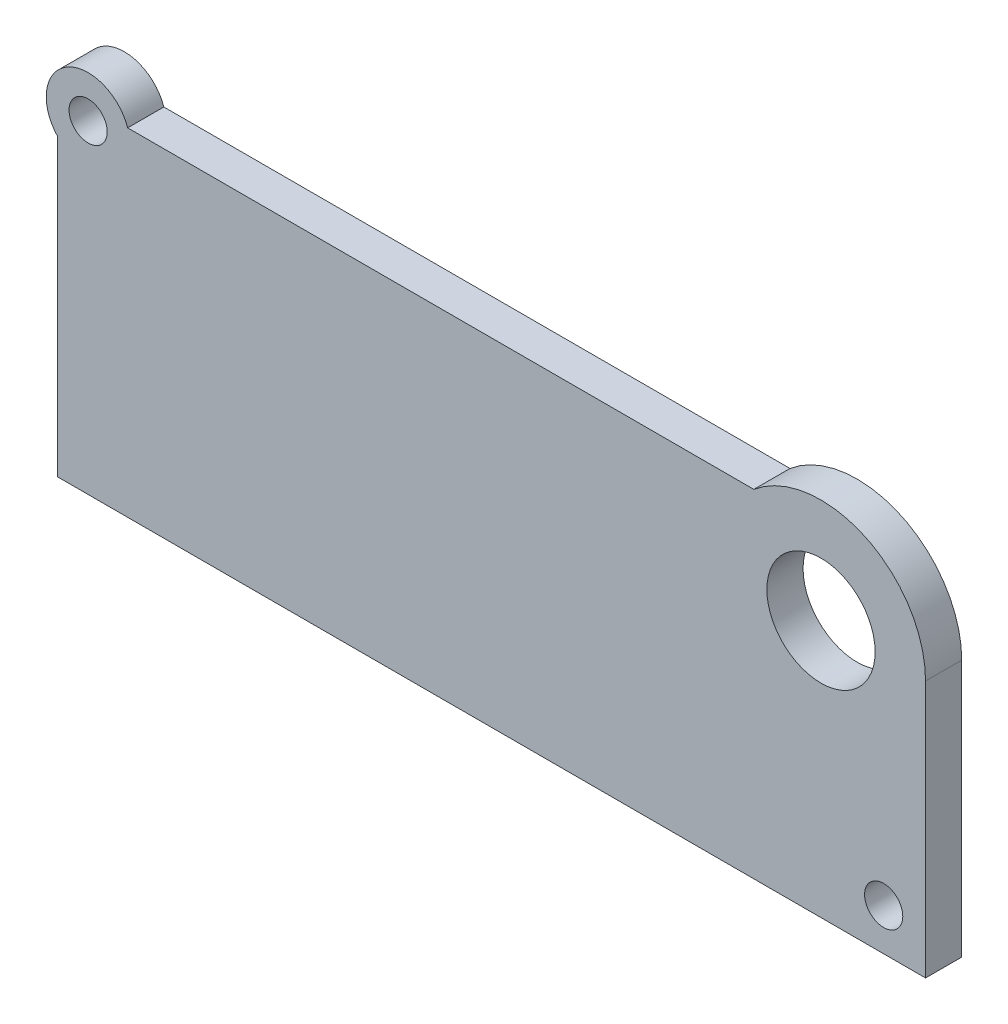
ISO-10303-21;
HEADER;
FILE_DESCRIPTION(('STEP AP214'),'2;1');
FILE_NAME('part.step','',(''),(''),'','','');
FILE_SCHEMA(('AUTOMOTIVE_DESIGN { 1 0 10303 214 1 1 1 1 }'));
ENDSEC;
DATA;
#1=APPLICATION_CONTEXT('core data for automotive mechanical design processes');
#2=APPLICATION_PROTOCOL_DEFINITION('international standard','automotive_design',2000,#1);
#3=PRODUCT_CONTEXT('',#1,'mechanical');
#4=PRODUCT('Part','Part','',(#3));
#5=PRODUCT_RELATED_PRODUCT_CATEGORY('part','',(#4));
#6=PRODUCT_DEFINITION_FORMATION('','',#4);
#7=PRODUCT_DEFINITION_CONTEXT('part definition',#1,'design');
#8=PRODUCT_DEFINITION('design','',#6,#7);
#9=PRODUCT_DEFINITION_SHAPE('','',#8);
#10=(LENGTH_UNIT() NAMED_UNIT(*) SI_UNIT(.MILLI.,.METRE.));
#11=(NAMED_UNIT(*) PLANE_ANGLE_UNIT() SI_UNIT($,.RADIAN.));
#12=(NAMED_UNIT(*) SI_UNIT($,.STERADIAN.) SOLID_ANGLE_UNIT());
#13=UNCERTAINTY_MEASURE_WITH_UNIT(LENGTH_MEASURE(1.E-05),#10,'distance_accuracy_value','');
#14=(GEOMETRIC_REPRESENTATION_CONTEXT(3) GLOBAL_UNCERTAINTY_ASSIGNED_CONTEXT((#13)) GLOBAL_UNIT_ASSIGNED_CONTEXT((#10,
#11,#12)) REPRESENTATION_CONTEXT('',''));
#15=CARTESIAN_POINT('',(0.,0.,0.));
#16=DIRECTION('',(0.,0.,1.));
#17=DIRECTION('',(1.,0.,0.));
#18=AXIS2_PLACEMENT_3D('',#15,#16,#17);
#19=CARTESIAN_POINT('',(0.,14.8,3.175));
#20=DIRECTION('',(0.,1.,0.));
#21=DIRECTION('',(0.,0.,1.));
#22=AXIS2_PLACEMENT_3D('',#19,#20,#21);
#23=PLANE('',#22);
#24=DIRECTION('',(0.,0.,-1.));
#25=VECTOR('',#24,1.);
#26=CARTESIAN_POINT('',(-20.2659099435317,14.8,13.5694696834423));
#27=LINE('',#26,#25);
#28=CARTESIAN_POINT('',(-20.2659099435317,14.8,3.175));
#29=VERTEX_POINT('',#28);
#30=CARTESIAN_POINT('',(-20.2659099435317,14.8,0.));
#31=VERTEX_POINT('',#30);
#32=EDGE_CURVE('E134',#29,#31,#27,.T.);
#33=ORIENTED_EDGE('',*,*,#32,.F.);
#34=DIRECTION('',(1.,0.,0.));
#35=VECTOR('',#34,1.);
#36=CARTESIAN_POINT('',(0.,14.8,3.175));
#37=LINE('',#36,#35);
#38=CARTESIAN_POINT('',(34.6802621326928,14.8,3.175));
#39=VERTEX_POINT('',#38);
#40=EDGE_CURVE('E123',#29,#39,#37,.T.);
#41=ORIENTED_EDGE('',*,*,#40,.T.);
#42=DIRECTION('',(0.,0.,-1.));
#43=VECTOR('',#42,1.);
#44=CARTESIAN_POINT('',(34.6802621326928,14.8,15.1599874843489));
#45=LINE('',#44,#43);
#46=CARTESIAN_POINT('',(34.6802621326928,14.8,0.));
#47=VERTEX_POINT('',#46);
#48=EDGE_CURVE('E168',#39,#47,#45,.T.);
#49=ORIENTED_EDGE('',*,*,#48,.T.);
#50=DIRECTION('',(1.,0.,0.));
#51=VECTOR('',#50,1.);
#52=CARTESIAN_POINT('',(0.,14.8,0.));
#53=LINE('',#52,#51);
#54=EDGE_CURVE('E83',#31,#47,#53,.T.);
#55=ORIENTED_EDGE('',*,*,#54,.F.);
#56=EDGE_LOOP('',(#33,#41,#49,#55));
#57=FACE_BOUND('',#56,.T.);
#58=ADVANCED_FACE('F67',(#57),#23,.T.);
#59=CARTESIAN_POINT('',(0.,0.,0.));
#60=DIRECTION('',(0.,0.,1.));
#61=DIRECTION('',(1.,0.,0.));
#62=AXIS2_PLACEMENT_3D('',#59,#60,#61);
#63=PLANE('',#62);
#64=CARTESIAN_POINT('',(46.076,-11.125,0.));
#65=DIRECTION('',(0.,0.,-1.));
#66=DIRECTION('',(-1.,0.,0.));
#67=AXIS2_PLACEMENT_3D('',#64,#65,#66);
#68=CIRCLE('',#67,1.675);
#69=CARTESIAN_POINT('',(44.401,-11.125,0.));
#70=VERTEX_POINT('',#69);
#71=EDGE_CURVE('E232',#70,#70,#68,.T.);
#72=ORIENTED_EDGE('',*,*,#71,.F.);
#73=EDGE_LOOP('',(#72));
#74=FACE_BOUND('',#73,.T.);
#75=DIRECTION('',(0.,1.,0.));
#76=VECTOR('',#75,1.);
#77=CARTESIAN_POINT('',(-26.416,0.,0.));
#78=LINE('',#77,#76);
#79=CARTESIAN_POINT('',(-26.416,-14.8,0.));
#80=VERTEX_POINT('',#79);
#81=CARTESIAN_POINT('',(-26.416,11.0753976457499,0.));
#82=VERTEX_POINT('',#81);
#83=EDGE_CURVE('E91',#80,#82,#78,.T.);
#84=ORIENTED_EDGE('',*,*,#83,.T.);
#85=CARTESIAN_POINT('',(-23.736,13.59,0.));
#86=DIRECTION('',(0.,0.,-1.));
#87=DIRECTION('',(-1.,0.,0.));
#88=AXIS2_PLACEMENT_3D('',#85,#86,#87);
#89=CIRCLE('',#88,3.675);
#90=EDGE_CURVE('E141',#82,#31,#89,.T.);
#91=ORIENTED_EDGE('',*,*,#90,.T.);
#92=ORIENTED_EDGE('',*,*,#54,.T.);
#93=CARTESIAN_POINT('',(40.576,7.77,0.));
#94=DIRECTION('',(0.,0.,-1.));
#95=DIRECTION('',(-1.,0.,0.));
#96=AXIS2_PLACEMENT_3D('',#93,#94,#95);
#97=CIRCLE('',#96,9.17500000000001);
#98=CARTESIAN_POINT('',(49.751,7.77,0.));
#99=VERTEX_POINT('',#98);
#100=EDGE_CURVE('E165',#47,#99,#97,.T.);
#101=ORIENTED_EDGE('',*,*,#100,.T.);
#102=DIRECTION('',(0.,-1.,0.));
#103=VECTOR('',#102,1.);
#104=CARTESIAN_POINT('',(49.751,0.,0.));
#105=LINE('',#104,#103);
#106=CARTESIAN_POINT('',(49.751,-14.8,0.));
#107=VERTEX_POINT('',#106);
#108=EDGE_CURVE('E155',#99,#107,#105,.T.);
#109=ORIENTED_EDGE('',*,*,#108,.T.);
#110=DIRECTION('',(-1.,0.,0.));
#111=VECTOR('',#110,1.);
#112=CARTESIAN_POINT('',(0.,-14.8,0.));
#113=LINE('',#112,#111);
#114=EDGE_CURVE('E175',#107,#80,#113,.T.);
#115=ORIENTED_EDGE('',*,*,#114,.T.);
#116=EDGE_LOOP('',(#84,#91,#92,#101,#109,#115));
#117=FACE_BOUND('',#116,.T.);
#118=CARTESIAN_POINT('',(40.576,7.77,0.));
#119=DIRECTION('',(0.,0.,-1.));
#120=DIRECTION('',(-1.,0.,0.));
#121=AXIS2_PLACEMENT_3D('',#118,#119,#120);
#122=CIRCLE('',#121,4.75);
#123=CARTESIAN_POINT('',(35.826,7.77,0.));
#124=VERTEX_POINT('',#123);
#125=EDGE_CURVE('E170',#124,#124,#122,.T.);
#126=ORIENTED_EDGE('',*,*,#125,.F.);
#127=EDGE_LOOP('',(#126));
#128=FACE_BOUND('',#127,.T.);
#129=CARTESIAN_POINT('',(-23.736,13.59,0.));
#130=DIRECTION('',(0.,0.,-1.));
#131=DIRECTION('',(-1.,0.,0.));
#132=AXIS2_PLACEMENT_3D('',#129,#130,#131);
#133=CIRCLE('',#132,1.675);
#134=CARTESIAN_POINT('',(-25.411,13.59,0.));
#135=VERTEX_POINT('',#134);
#136=EDGE_CURVE('E149',#135,#135,#133,.T.);
#137=ORIENTED_EDGE('',*,*,#136,.F.);
#138=EDGE_LOOP('',(#137));
#139=FACE_BOUND('',#138,.T.);
#140=ADVANCED_FACE('F178',(#74,#117,#128,#139),#63,.F.);
#141=CARTESIAN_POINT('',(0.,0.,3.175));
#142=DIRECTION('',(0.,0.,1.));
#143=DIRECTION('',(1.,0.,0.));
#144=AXIS2_PLACEMENT_3D('',#141,#142,#143);
#145=PLANE('',#144);
#146=CARTESIAN_POINT('',(-23.736,13.59,3.175));
#147=DIRECTION('',(0.,0.,1.));
#148=DIRECTION('',(1.,0.,0.));
#149=AXIS2_PLACEMENT_3D('',#146,#147,#148);
#150=CIRCLE('',#149,3.675);
#151=CARTESIAN_POINT('',(-26.416,11.0753976457499,3.175));
#152=VERTEX_POINT('',#151);
#153=EDGE_CURVE('E128',#152,#29,#150,.F.);
#154=ORIENTED_EDGE('',*,*,#153,.F.);
#155=DIRECTION('',(0.,1.,0.));
#156=VECTOR('',#155,1.);
#157=CARTESIAN_POINT('',(-26.416,0.,3.175));
#158=LINE('',#157,#156);
#159=CARTESIAN_POINT('',(-26.416,-14.8,3.175));
#160=VERTEX_POINT('',#159);
#161=EDGE_CURVE('E76',#160,#152,#158,.T.);
#162=ORIENTED_EDGE('',*,*,#161,.F.);
#163=DIRECTION('',(-1.,0.,0.));
#164=VECTOR('',#163,1.);
#165=CARTESIAN_POINT('',(0.,-14.8,3.175));
#166=LINE('',#165,#164);
#167=CARTESIAN_POINT('',(49.751,-14.8,3.175));
#168=VERTEX_POINT('',#167);
#169=EDGE_CURVE('E132',#168,#160,#166,.T.);
#170=ORIENTED_EDGE('',*,*,#169,.F.);
#171=DIRECTION('',(0.,1.,0.));
#172=VECTOR('',#171,1.);
#173=CARTESIAN_POINT('',(49.751,0.,3.175));
#174=LINE('',#173,#172);
#175=CARTESIAN_POINT('',(49.751,7.77,3.175));
#176=VERTEX_POINT('',#175);
#177=EDGE_CURVE('E162',#168,#176,#174,.T.);
#178=ORIENTED_EDGE('',*,*,#177,.T.);
#179=CARTESIAN_POINT('',(40.576,7.77,3.175));
#180=DIRECTION('',(0.,0.,1.));
#181=DIRECTION('',(1.,0.,0.));
#182=AXIS2_PLACEMENT_3D('',#179,#180,#181);
#183=CIRCLE('',#182,9.17500000000001);
#184=EDGE_CURVE('E130',#39,#176,#183,.F.);
#185=ORIENTED_EDGE('',*,*,#184,.F.);
#186=ORIENTED_EDGE('',*,*,#40,.F.);
#187=EDGE_LOOP('',(#154,#162,#170,#178,#185,#186));
#188=FACE_BOUND('',#187,.T.);
#189=CARTESIAN_POINT('',(46.076,-11.125,3.175));
#190=DIRECTION('',(0.,0.,1.));
#191=DIRECTION('',(1.,0.,0.));
#192=AXIS2_PLACEMENT_3D('',#189,#190,#191);
#193=CIRCLE('',#192,1.675);
#194=CARTESIAN_POINT('',(47.751,-11.125,3.175));
#195=VERTEX_POINT('',#194);
#196=EDGE_CURVE('E143',#195,#195,#193,.F.);
#197=ORIENTED_EDGE('',*,*,#196,.T.);
#198=EDGE_LOOP('',(#197));
#199=FACE_BOUND('',#198,.T.);
#200=CARTESIAN_POINT('',(-23.736,13.59,3.175));
#201=DIRECTION('',(0.,0.,1.));
#202=DIRECTION('',(1.,0.,0.));
#203=AXIS2_PLACEMENT_3D('',#200,#201,#202);
#204=CIRCLE('',#203,1.675);
#205=CARTESIAN_POINT('',(-22.061,13.59,3.175));
#206=VERTEX_POINT('',#205);
#207=EDGE_CURVE('E152',#206,#206,#204,.T.);
#208=ORIENTED_EDGE('',*,*,#207,.F.);
#209=EDGE_LOOP('',(#208));
#210=FACE_BOUND('',#209,.T.);
#211=CARTESIAN_POINT('',(40.576,7.77,3.175));
#212=DIRECTION('',(0.,0.,1.));
#213=DIRECTION('',(1.,0.,0.));
#214=AXIS2_PLACEMENT_3D('',#211,#212,#213);
#215=CIRCLE('',#214,4.75);
#216=CARTESIAN_POINT('',(45.326,7.77,3.175));
#217=VERTEX_POINT('',#216);
#218=EDGE_CURVE('E71',#217,#217,#215,.T.);
#219=ORIENTED_EDGE('',*,*,#218,.F.);
#220=EDGE_LOOP('',(#219));
#221=FACE_BOUND('',#220,.T.);
#222=ADVANCED_FACE('F124',(#188,#199,#210,#221),#145,.T.);
#223=CARTESIAN_POINT('',(0.,-14.8,3.175));
#224=DIRECTION('',(0.,-1.,0.));
#225=DIRECTION('',(1.,0.,0.));
#226=AXIS2_PLACEMENT_3D('',#223,#224,#225);
#227=PLANE('',#226);
#228=ORIENTED_EDGE('',*,*,#114,.F.);
#229=DIRECTION('',(0.,0.,-1.));
#230=VECTOR('',#229,1.);
#231=CARTESIAN_POINT('',(49.751,-14.8,10.));
#232=LINE('',#231,#230);
#233=EDGE_CURVE('E158',#168,#107,#232,.T.);
#234=ORIENTED_EDGE('',*,*,#233,.F.);
#235=ORIENTED_EDGE('',*,*,#169,.T.);
#236=DIRECTION('',(0.,0.,-1.));
#237=VECTOR('',#236,1.);
#238=CARTESIAN_POINT('',(-26.416,-14.8,3.175));
#239=LINE('',#238,#237);
#240=EDGE_CURVE('E12',#160,#80,#239,.T.);
#241=ORIENTED_EDGE('',*,*,#240,.T.);
#242=EDGE_LOOP('',(#228,#234,#235,#241));
#243=FACE_BOUND('',#242,.T.);
#244=ADVANCED_FACE('F69',(#243),#227,.T.);
#245=CARTESIAN_POINT('',(-26.416,0.,3.175));
#246=DIRECTION('',(-1.,0.,0.));
#247=DIRECTION('',(0.,0.,1.));
#248=AXIS2_PLACEMENT_3D('',#245,#246,#247);
#249=PLANE('',#248);
#250=ORIENTED_EDGE('',*,*,#161,.T.);
#251=DIRECTION('',(0.,0.,-1.));
#252=VECTOR('',#251,1.);
#253=CARTESIAN_POINT('',(-26.416,11.0753976457499,13.5694696834423));
#254=LINE('',#253,#252);
#255=EDGE_CURVE('E137',#82,#152,#254,.F.);
#256=ORIENTED_EDGE('',*,*,#255,.F.);
#257=ORIENTED_EDGE('',*,*,#83,.F.);
#258=ORIENTED_EDGE('',*,*,#240,.F.);
#259=EDGE_LOOP('',(#250,#256,#257,#258));
#260=FACE_BOUND('',#259,.T.);
#261=ADVANCED_FACE('F193',(#260),#249,.T.);
#262=CARTESIAN_POINT('',(40.576,7.77,10.));
#263=DIRECTION('',(0.,0.,-1.));
#264=DIRECTION('',(-1.,0.,0.));
#265=AXIS2_PLACEMENT_3D('',#262,#263,#264);
#266=CYLINDRICAL_SURFACE('',#265,4.75);
#267=ORIENTED_EDGE('',*,*,#218,.T.);
#268=EDGE_LOOP('',(#267));
#269=FACE_BOUND('',#268,.T.);
#270=ORIENTED_EDGE('',*,*,#125,.T.);
#271=EDGE_LOOP('',(#270));
#272=FACE_BOUND('',#271,.T.);
#273=ADVANCED_FACE('F195',(#269,#272),#266,.F.);
#274=CARTESIAN_POINT('',(40.576,7.77,15.1599874843489));
#275=DIRECTION('',(0.,0.,-1.));
#276=DIRECTION('',(-1.,0.,0.));
#277=AXIS2_PLACEMENT_3D('',#274,#275,#276);
#278=CYLINDRICAL_SURFACE('',#277,9.17500000000001);
#279=ORIENTED_EDGE('',*,*,#48,.F.);
#280=ORIENTED_EDGE('',*,*,#184,.T.);
#281=DIRECTION('',(0.,0.,-1.));
#282=VECTOR('',#281,1.);
#283=CARTESIAN_POINT('',(49.751,7.77,10.));
#284=LINE('',#283,#282);
#285=EDGE_CURVE('E159',#176,#99,#284,.T.);
#286=ORIENTED_EDGE('',*,*,#285,.T.);
#287=ORIENTED_EDGE('',*,*,#100,.F.);
#288=EDGE_LOOP('',(#279,#280,#286,#287));
#289=FACE_BOUND('',#288,.T.);
#290=ADVANCED_FACE('F182',(#289),#278,.T.);
#291=CARTESIAN_POINT('',(49.751,0.,10.));
#292=DIRECTION('',(1.,0.,0.));
#293=DIRECTION('',(0.,0.,-1.));
#294=AXIS2_PLACEMENT_3D('',#291,#292,#293);
#295=PLANE('',#294);
#296=ORIENTED_EDGE('',*,*,#233,.T.);
#297=ORIENTED_EDGE('',*,*,#108,.F.);
#298=ORIENTED_EDGE('',*,*,#285,.F.);
#299=ORIENTED_EDGE('',*,*,#177,.F.);
#300=EDGE_LOOP('',(#296,#297,#298,#299));
#301=FACE_BOUND('',#300,.T.);
#302=ADVANCED_FACE('F186',(#301),#295,.T.);
#303=CARTESIAN_POINT('',(-23.736,13.59,10.));
#304=DIRECTION('',(0.,0.,-1.));
#305=DIRECTION('',(-1.,0.,0.));
#306=AXIS2_PLACEMENT_3D('',#303,#304,#305);
#307=CYLINDRICAL_SURFACE('',#306,1.675);
#308=ORIENTED_EDGE('',*,*,#136,.T.);
#309=EDGE_LOOP('',(#308));
#310=FACE_BOUND('',#309,.T.);
#311=ORIENTED_EDGE('',*,*,#207,.T.);
#312=EDGE_LOOP('',(#311));
#313=FACE_BOUND('',#312,.T.);
#314=ADVANCED_FACE('F219',(#310,#313),#307,.F.);
#315=CARTESIAN_POINT('',(-23.736,13.59,13.5694696834423));
#316=DIRECTION('',(0.,0.,-1.));
#317=DIRECTION('',(-1.,0.,0.));
#318=AXIS2_PLACEMENT_3D('',#315,#316,#317);
#319=CYLINDRICAL_SURFACE('',#318,3.675);
#320=ORIENTED_EDGE('',*,*,#90,.F.);
#321=ORIENTED_EDGE('',*,*,#255,.T.);
#322=ORIENTED_EDGE('',*,*,#153,.T.);
#323=ORIENTED_EDGE('',*,*,#32,.T.);
#324=EDGE_LOOP('',(#320,#321,#322,#323));
#325=FACE_BOUND('',#324,.T.);
#326=ADVANCED_FACE('F140',(#325),#319,.T.);
#327=CARTESIAN_POINT('',(46.076,-11.125,7.91261543394987));
#328=DIRECTION('',(0.,0.,-1.));
#329=DIRECTION('',(-1.,0.,0.));
#330=AXIS2_PLACEMENT_3D('',#327,#328,#329);
#331=CYLINDRICAL_SURFACE('',#330,1.675);
#332=ORIENTED_EDGE('',*,*,#71,.T.);
#333=EDGE_LOOP('',(#332));
#334=FACE_BOUND('',#333,.T.);
#335=ORIENTED_EDGE('',*,*,#196,.F.);
#336=EDGE_LOOP('',(#335));
#337=FACE_BOUND('',#336,.T.);
#338=ADVANCED_FACE('F225',(#334,#337),#331,.F.);
#339=CLOSED_SHELL('',(#58,#140,#222,#244,#261,#273,#290,#302,#314,#326,#338));
#340=MANIFOLD_SOLID_BREP('B2',#339);
#341=ADVANCED_BREP_SHAPE_REPRESENTATION('',(#18,#340),#14);
#342=SHAPE_DEFINITION_REPRESENTATION(#9,#341);
ENDSEC;
END-ISO-10303-21;
